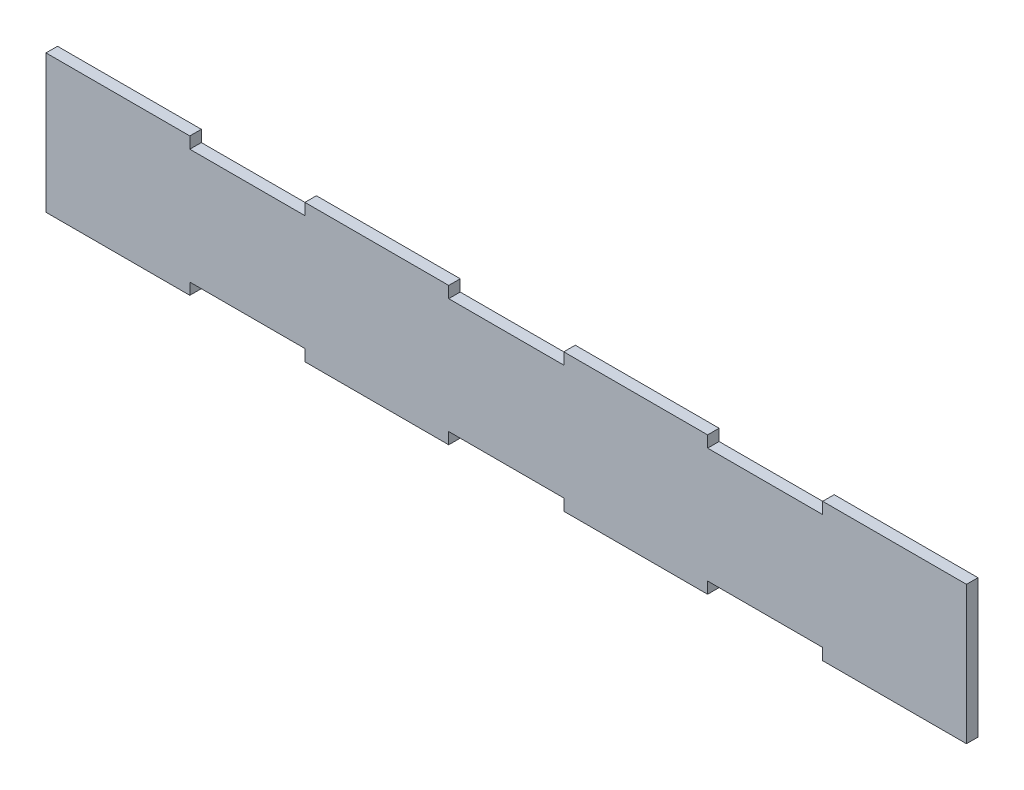
ISO-10303-21;
HEADER;
FILE_DESCRIPTION(('STEP AP214'),'2;1');
FILE_NAME('part.step','',(''),(''),'','','');
FILE_SCHEMA(('AUTOMOTIVE_DESIGN { 1 0 10303 214 1 1 1 1 }'));
ENDSEC;
DATA;
#1=APPLICATION_CONTEXT('core data for automotive mechanical design processes');
#2=APPLICATION_PROTOCOL_DEFINITION('international standard','automotive_design',2000,#1);
#3=PRODUCT_CONTEXT('',#1,'mechanical');
#4=PRODUCT('Part','Part','',(#3));
#5=PRODUCT_RELATED_PRODUCT_CATEGORY('part','',(#4));
#6=PRODUCT_DEFINITION_FORMATION('','',#4);
#7=PRODUCT_DEFINITION_CONTEXT('part definition',#1,'design');
#8=PRODUCT_DEFINITION('design','',#6,#7);
#9=PRODUCT_DEFINITION_SHAPE('','',#8);
#10=(LENGTH_UNIT() NAMED_UNIT(*) SI_UNIT(.MILLI.,.METRE.));
#11=(NAMED_UNIT(*) PLANE_ANGLE_UNIT() SI_UNIT($,.RADIAN.));
#12=(NAMED_UNIT(*) SI_UNIT($,.STERADIAN.) SOLID_ANGLE_UNIT());
#13=UNCERTAINTY_MEASURE_WITH_UNIT(LENGTH_MEASURE(1.E-05),#10,'distance_accuracy_value','');
#14=(GEOMETRIC_REPRESENTATION_CONTEXT(3) GLOBAL_UNCERTAINTY_ASSIGNED_CONTEXT((#13)) GLOBAL_UNIT_ASSIGNED_CONTEXT((#10,
#11,#12)) REPRESENTATION_CONTEXT('',''));
#15=CARTESIAN_POINT('',(0.,0.,0.));
#16=DIRECTION('',(0.,0.,1.));
#17=DIRECTION('',(1.,0.,0.));
#18=AXIS2_PLACEMENT_3D('',#15,#16,#17);
#19=CARTESIAN_POINT('',(115.,0.,2.));
#20=DIRECTION('',(-1.,0.,0.));
#21=DIRECTION('',(0.,0.,1.));
#22=AXIS2_PLACEMENT_3D('',#19,#20,#21);
#23=PLANE('',#22);
#24=DIRECTION('',(0.,1.,0.));
#25=VECTOR('',#24,1.);
#26=CARTESIAN_POINT('',(115.,0.,0.));
#27=LINE('',#26,#25);
#28=CARTESIAN_POINT('',(115.,0.,0.));
#29=VERTEX_POINT('',#28);
#30=CARTESIAN_POINT('',(115.,2.,0.));
#31=VERTEX_POINT('',#30);
#32=EDGE_CURVE('E263',#29,#31,#27,.T.);
#33=ORIENTED_EDGE('',*,*,#32,.T.);
#34=DIRECTION('',(0.,0.,-1.));
#35=VECTOR('',#34,1.);
#36=CARTESIAN_POINT('',(115.,2.,2.));
#37=LINE('',#36,#35);
#38=CARTESIAN_POINT('',(115.,2.,2.));
#39=VERTEX_POINT('',#38);
#40=EDGE_CURVE('E11',#39,#31,#37,.T.);
#41=ORIENTED_EDGE('',*,*,#40,.F.);
#42=DIRECTION('',(0.,1.,0.));
#43=VECTOR('',#42,1.);
#44=CARTESIAN_POINT('',(115.,0.,2.));
#45=LINE('',#44,#43);
#46=CARTESIAN_POINT('',(115.,0.,2.));
#47=VERTEX_POINT('',#46);
#48=EDGE_CURVE('E364',#47,#39,#45,.T.);
#49=ORIENTED_EDGE('',*,*,#48,.F.);
#50=DIRECTION('',(0.,0.,-1.));
#51=VECTOR('',#50,1.);
#52=CARTESIAN_POINT('',(115.,0.,2.));
#53=LINE('',#52,#51);
#54=EDGE_CURVE('E58',#47,#29,#53,.T.);
#55=ORIENTED_EDGE('',*,*,#54,.T.);
#56=EDGE_LOOP('',(#33,#41,#49,#55));
#57=FACE_BOUND('',#56,.T.);
#58=ADVANCED_FACE('F41',(#57),#23,.F.);
#59=CARTESIAN_POINT('',(0.,2.,2.));
#60=DIRECTION('',(0.,1.,0.));
#61=DIRECTION('',(0.,0.,1.));
#62=AXIS2_PLACEMENT_3D('',#59,#60,#61);
#63=PLANE('',#62);
#64=DIRECTION('',(1.,0.,0.));
#65=VECTOR('',#64,1.);
#66=CARTESIAN_POINT('',(0.,2.,0.));
#67=LINE('',#66,#65);
#68=CARTESIAN_POINT('',(135.,2.,0.));
#69=VERTEX_POINT('',#68);
#70=EDGE_CURVE('E266',#31,#69,#67,.T.);
#71=ORIENTED_EDGE('',*,*,#70,.T.);
#72=DIRECTION('',(0.,0.,-1.));
#73=VECTOR('',#72,1.);
#74=CARTESIAN_POINT('',(135.,2.,2.));
#75=LINE('',#74,#73);
#76=CARTESIAN_POINT('',(135.,2.,2.));
#77=VERTEX_POINT('',#76);
#78=EDGE_CURVE('E50',#77,#69,#75,.T.);
#79=ORIENTED_EDGE('',*,*,#78,.F.);
#80=DIRECTION('',(1.,0.,0.));
#81=VECTOR('',#80,1.);
#82=CARTESIAN_POINT('',(0.,2.,2.));
#83=LINE('',#82,#81);
#84=EDGE_CURVE('E156',#39,#77,#83,.T.);
#85=ORIENTED_EDGE('',*,*,#84,.F.);
#86=ORIENTED_EDGE('',*,*,#40,.T.);
#87=EDGE_LOOP('',(#71,#79,#85,#86));
#88=FACE_BOUND('',#87,.T.);
#89=ADVANCED_FACE('F449',(#88),#63,.F.);
#90=CARTESIAN_POINT('',(135.,0.,2.));
#91=DIRECTION('',(-1.,0.,0.));
#92=DIRECTION('',(0.,0.,1.));
#93=AXIS2_PLACEMENT_3D('',#90,#91,#92);
#94=PLANE('',#93);
#95=DIRECTION('',(0.,1.,0.));
#96=VECTOR('',#95,1.);
#97=CARTESIAN_POINT('',(135.,0.,0.));
#98=LINE('',#97,#96);
#99=CARTESIAN_POINT('',(135.,0.,0.));
#100=VERTEX_POINT('',#99);
#101=EDGE_CURVE('E270',#100,#69,#98,.T.);
#102=ORIENTED_EDGE('',*,*,#101,.F.);
#103=DIRECTION('',(0.,0.,-1.));
#104=VECTOR('',#103,1.);
#105=CARTESIAN_POINT('',(135.,0.,2.));
#106=LINE('',#105,#104);
#107=CARTESIAN_POINT('',(135.,0.,2.));
#108=VERTEX_POINT('',#107);
#109=EDGE_CURVE('E440',#108,#100,#106,.T.);
#110=ORIENTED_EDGE('',*,*,#109,.F.);
#111=DIRECTION('',(0.,1.,0.));
#112=VECTOR('',#111,1.);
#113=CARTESIAN_POINT('',(135.,0.,2.));
#114=LINE('',#113,#112);
#115=EDGE_CURVE('E448',#108,#77,#114,.T.);
#116=ORIENTED_EDGE('',*,*,#115,.T.);
#117=ORIENTED_EDGE('',*,*,#78,.T.);
#118=EDGE_LOOP('',(#102,#110,#116,#117));
#119=FACE_BOUND('',#118,.T.);
#120=ADVANCED_FACE('F446',(#119),#94,.T.);
#121=CARTESIAN_POINT('',(0.,0.,2.));
#122=DIRECTION('',(0.,1.,0.));
#123=DIRECTION('',(-1.,0.,0.));
#124=AXIS2_PLACEMENT_3D('',#121,#122,#123);
#125=PLANE('',#124);
#126=DIRECTION('',(1.,0.,0.));
#127=VECTOR('',#126,1.);
#128=CARTESIAN_POINT('',(0.,0.,0.));
#129=LINE('',#128,#127);
#130=CARTESIAN_POINT('',(160.,0.,0.));
#131=VERTEX_POINT('',#130);
#132=EDGE_CURVE('E274',#100,#131,#129,.T.);
#133=ORIENTED_EDGE('',*,*,#132,.T.);
#134=DIRECTION('',(0.,0.,-1.));
#135=VECTOR('',#134,1.);
#136=CARTESIAN_POINT('',(160.,0.,2.));
#137=LINE('',#136,#135);
#138=CARTESIAN_POINT('',(160.,0.,2.));
#139=VERTEX_POINT('',#138);
#140=EDGE_CURVE('E436',#139,#131,#137,.T.);
#141=ORIENTED_EDGE('',*,*,#140,.F.);
#142=DIRECTION('',(1.,0.,0.));
#143=VECTOR('',#142,1.);
#144=CARTESIAN_POINT('',(0.,0.,2.));
#145=LINE('',#144,#143);
#146=EDGE_CURVE('E468',#108,#139,#145,.T.);
#147=ORIENTED_EDGE('',*,*,#146,.F.);
#148=ORIENTED_EDGE('',*,*,#109,.T.);
#149=EDGE_LOOP('',(#133,#141,#147,#148));
#150=FACE_BOUND('',#149,.T.);
#151=ADVANCED_FACE('F458',(#150),#125,.F.);
#152=CARTESIAN_POINT('',(160.,0.,2.));
#153=DIRECTION('',(-1.,0.,0.));
#154=DIRECTION('',(0.,0.,1.));
#155=AXIS2_PLACEMENT_3D('',#152,#153,#154);
#156=PLANE('',#155);
#157=DIRECTION('',(0.,1.,0.));
#158=VECTOR('',#157,1.);
#159=CARTESIAN_POINT('',(160.,0.,0.));
#160=LINE('',#159,#158);
#161=CARTESIAN_POINT('',(160.,24.,0.));
#162=VERTEX_POINT('',#161);
#163=EDGE_CURVE('E277',#131,#162,#160,.T.);
#164=ORIENTED_EDGE('',*,*,#163,.T.);
#165=DIRECTION('',(0.,0.,-1.));
#166=VECTOR('',#165,1.);
#167=CARTESIAN_POINT('',(160.,24.,2.));
#168=LINE('',#167,#166);
#169=CARTESIAN_POINT('',(160.,24.,2.));
#170=VERTEX_POINT('',#169);
#171=EDGE_CURVE('E432',#170,#162,#168,.T.);
#172=ORIENTED_EDGE('',*,*,#171,.F.);
#173=DIRECTION('',(0.,1.,0.));
#174=VECTOR('',#173,1.);
#175=CARTESIAN_POINT('',(160.,0.,2.));
#176=LINE('',#175,#174);
#177=EDGE_CURVE('E464',#139,#170,#176,.T.);
#178=ORIENTED_EDGE('',*,*,#177,.F.);
#179=ORIENTED_EDGE('',*,*,#140,.T.);
#180=EDGE_LOOP('',(#164,#172,#178,#179));
#181=FACE_BOUND('',#180,.T.);
#182=ADVANCED_FACE('F462',(#181),#156,.F.);
#183=CARTESIAN_POINT('',(0.,24.,2.));
#184=DIRECTION('',(0.,-1.,0.));
#185=DIRECTION('',(1.,0.,0.));
#186=AXIS2_PLACEMENT_3D('',#183,#184,#185);
#187=PLANE('',#186);
#188=DIRECTION('',(-1.,0.,0.));
#189=VECTOR('',#188,1.);
#190=CARTESIAN_POINT('',(0.,24.,0.));
#191=LINE('',#190,#189);
#192=CARTESIAN_POINT('',(135.,24.,0.));
#193=VERTEX_POINT('',#192);
#194=EDGE_CURVE('E280',#162,#193,#191,.T.);
#195=ORIENTED_EDGE('',*,*,#194,.T.);
#196=DIRECTION('',(0.,0.,-1.));
#197=VECTOR('',#196,1.);
#198=CARTESIAN_POINT('',(135.,24.,2.));
#199=LINE('',#198,#197);
#200=CARTESIAN_POINT('',(135.,24.,2.));
#201=VERTEX_POINT('',#200);
#202=EDGE_CURVE('E428',#201,#193,#199,.T.);
#203=ORIENTED_EDGE('',*,*,#202,.F.);
#204=DIRECTION('',(-1.,0.,0.));
#205=VECTOR('',#204,1.);
#206=CARTESIAN_POINT('',(0.,24.,2.));
#207=LINE('',#206,#205);
#208=EDGE_CURVE('E467',#170,#201,#207,.T.);
#209=ORIENTED_EDGE('',*,*,#208,.F.);
#210=ORIENTED_EDGE('',*,*,#171,.T.);
#211=EDGE_LOOP('',(#195,#203,#209,#210));
#212=FACE_BOUND('',#211,.T.);
#213=ADVANCED_FACE('F578',(#212),#187,.F.);
#214=CARTESIAN_POINT('',(135.,0.,2.));
#215=DIRECTION('',(1.,0.,0.));
#216=DIRECTION('',(0.,0.,-1.));
#217=AXIS2_PLACEMENT_3D('',#214,#215,#216);
#218=PLANE('',#217);
#219=DIRECTION('',(0.,-1.,0.));
#220=VECTOR('',#219,1.);
#221=CARTESIAN_POINT('',(135.,0.,0.));
#222=LINE('',#221,#220);
#223=CARTESIAN_POINT('',(135.,22.,0.));
#224=VERTEX_POINT('',#223);
#225=EDGE_CURVE('E283',#193,#224,#222,.T.);
#226=ORIENTED_EDGE('',*,*,#225,.T.);
#227=DIRECTION('',(0.,0.,-1.));
#228=VECTOR('',#227,1.);
#229=CARTESIAN_POINT('',(135.,22.,2.));
#230=LINE('',#229,#228);
#231=CARTESIAN_POINT('',(135.,22.,2.));
#232=VERTEX_POINT('',#231);
#233=EDGE_CURVE('E425',#232,#224,#230,.T.);
#234=ORIENTED_EDGE('',*,*,#233,.F.);
#235=DIRECTION('',(0.,-1.,0.));
#236=VECTOR('',#235,1.);
#237=CARTESIAN_POINT('',(135.,0.,2.));
#238=LINE('',#237,#236);
#239=EDGE_CURVE('E472',#201,#232,#238,.T.);
#240=ORIENTED_EDGE('',*,*,#239,.F.);
#241=ORIENTED_EDGE('',*,*,#202,.T.);
#242=EDGE_LOOP('',(#226,#234,#240,#241));
#243=FACE_BOUND('',#242,.T.);
#244=ADVANCED_FACE('F581',(#243),#218,.F.);
#245=CARTESIAN_POINT('',(0.,22.,2.));
#246=DIRECTION('',(0.,1.,0.));
#247=DIRECTION('',(0.,0.,1.));
#248=AXIS2_PLACEMENT_3D('',#245,#246,#247);
#249=PLANE('',#248);
#250=DIRECTION('',(1.,0.,0.));
#251=VECTOR('',#250,1.);
#252=CARTESIAN_POINT('',(0.,22.,0.));
#253=LINE('',#252,#251);
#254=CARTESIAN_POINT('',(115.,22.,0.));
#255=VERTEX_POINT('',#254);
#256=EDGE_CURVE('E287',#255,#224,#253,.T.);
#257=ORIENTED_EDGE('',*,*,#256,.F.);
#258=DIRECTION('',(0.,0.,-1.));
#259=VECTOR('',#258,1.);
#260=CARTESIAN_POINT('',(115.,22.,2.));
#261=LINE('',#260,#259);
#262=CARTESIAN_POINT('',(115.,22.,2.));
#263=VERTEX_POINT('',#262);
#264=EDGE_CURVE('E422',#263,#255,#261,.T.);
#265=ORIENTED_EDGE('',*,*,#264,.F.);
#266=DIRECTION('',(1.,0.,0.));
#267=VECTOR('',#266,1.);
#268=CARTESIAN_POINT('',(0.,22.,2.));
#269=LINE('',#268,#267);
#270=EDGE_CURVE('E479',#263,#232,#269,.T.);
#271=ORIENTED_EDGE('',*,*,#270,.T.);
#272=ORIENTED_EDGE('',*,*,#233,.T.);
#273=EDGE_LOOP('',(#257,#265,#271,#272));
#274=FACE_BOUND('',#273,.T.);
#275=ADVANCED_FACE('F585',(#274),#249,.T.);
#276=CARTESIAN_POINT('',(115.,0.,2.));
#277=DIRECTION('',(1.,0.,0.));
#278=DIRECTION('',(0.,0.,-1.));
#279=AXIS2_PLACEMENT_3D('',#276,#277,#278);
#280=PLANE('',#279);
#281=DIRECTION('',(0.,-1.,0.));
#282=VECTOR('',#281,1.);
#283=CARTESIAN_POINT('',(115.,0.,0.));
#284=LINE('',#283,#282);
#285=CARTESIAN_POINT('',(115.,24.,0.));
#286=VERTEX_POINT('',#285);
#287=EDGE_CURVE('E291',#286,#255,#284,.T.);
#288=ORIENTED_EDGE('',*,*,#287,.F.);
#289=DIRECTION('',(0.,0.,-1.));
#290=VECTOR('',#289,1.);
#291=CARTESIAN_POINT('',(115.,24.,2.));
#292=LINE('',#291,#290);
#293=CARTESIAN_POINT('',(115.,24.,2.));
#294=VERTEX_POINT('',#293);
#295=EDGE_CURVE('E419',#294,#286,#292,.T.);
#296=ORIENTED_EDGE('',*,*,#295,.F.);
#297=DIRECTION('',(0.,-1.,0.));
#298=VECTOR('',#297,1.);
#299=CARTESIAN_POINT('',(115.,0.,2.));
#300=LINE('',#299,#298);
#301=EDGE_CURVE('E483',#294,#263,#300,.T.);
#302=ORIENTED_EDGE('',*,*,#301,.T.);
#303=ORIENTED_EDGE('',*,*,#264,.T.);
#304=EDGE_LOOP('',(#288,#296,#302,#303));
#305=FACE_BOUND('',#304,.T.);
#306=ADVANCED_FACE('F589',(#305),#280,.T.);
#307=CARTESIAN_POINT('',(0.,24.,2.));
#308=DIRECTION('',(0.,1.,0.));
#309=DIRECTION('',(0.,0.,1.));
#310=AXIS2_PLACEMENT_3D('',#307,#308,#309);
#311=PLANE('',#310);
#312=DIRECTION('',(1.,0.,0.));
#313=VECTOR('',#312,1.);
#314=CARTESIAN_POINT('',(0.,24.,0.));
#315=LINE('',#314,#313);
#316=CARTESIAN_POINT('',(90.,24.,0.));
#317=VERTEX_POINT('',#316);
#318=EDGE_CURVE('E295',#317,#286,#315,.T.);
#319=ORIENTED_EDGE('',*,*,#318,.F.);
#320=DIRECTION('',(0.,0.,-1.));
#321=VECTOR('',#320,1.);
#322=CARTESIAN_POINT('',(90.,24.,2.));
#323=LINE('',#322,#321);
#324=CARTESIAN_POINT('',(90.,24.,2.));
#325=VERTEX_POINT('',#324);
#326=EDGE_CURVE('E416',#325,#317,#323,.T.);
#327=ORIENTED_EDGE('',*,*,#326,.F.);
#328=DIRECTION('',(1.,0.,0.));
#329=VECTOR('',#328,1.);
#330=CARTESIAN_POINT('',(0.,24.,2.));
#331=LINE('',#330,#329);
#332=EDGE_CURVE('E487',#325,#294,#331,.T.);
#333=ORIENTED_EDGE('',*,*,#332,.T.);
#334=ORIENTED_EDGE('',*,*,#295,.T.);
#335=EDGE_LOOP('',(#319,#327,#333,#334));
#336=FACE_BOUND('',#335,.T.);
#337=ADVANCED_FACE('F593',(#336),#311,.T.);
#338=CARTESIAN_POINT('',(90.,0.,2.));
#339=DIRECTION('',(1.,0.,0.));
#340=DIRECTION('',(0.,0.,-1.));
#341=AXIS2_PLACEMENT_3D('',#338,#339,#340);
#342=PLANE('',#341);
#343=DIRECTION('',(0.,-1.,0.));
#344=VECTOR('',#343,1.);
#345=CARTESIAN_POINT('',(90.,0.,0.));
#346=LINE('',#345,#344);
#347=CARTESIAN_POINT('',(90.,22.,0.));
#348=VERTEX_POINT('',#347);
#349=EDGE_CURVE('E299',#317,#348,#346,.T.);
#350=ORIENTED_EDGE('',*,*,#349,.T.);
#351=DIRECTION('',(0.,0.,-1.));
#352=VECTOR('',#351,1.);
#353=CARTESIAN_POINT('',(90.,22.,2.));
#354=LINE('',#353,#352);
#355=CARTESIAN_POINT('',(90.,22.,2.));
#356=VERTEX_POINT('',#355);
#357=EDGE_CURVE('E413',#356,#348,#354,.T.);
#358=ORIENTED_EDGE('',*,*,#357,.F.);
#359=DIRECTION('',(0.,-1.,0.));
#360=VECTOR('',#359,1.);
#361=CARTESIAN_POINT('',(90.,0.,2.));
#362=LINE('',#361,#360);
#363=EDGE_CURVE('E491',#325,#356,#362,.T.);
#364=ORIENTED_EDGE('',*,*,#363,.F.);
#365=ORIENTED_EDGE('',*,*,#326,.T.);
#366=EDGE_LOOP('',(#350,#358,#364,#365));
#367=FACE_BOUND('',#366,.T.);
#368=ADVANCED_FACE('F597',(#367),#342,.F.);
#369=CARTESIAN_POINT('',(0.,22.,2.));
#370=DIRECTION('',(0.,1.,0.));
#371=DIRECTION('',(0.,0.,1.));
#372=AXIS2_PLACEMENT_3D('',#369,#370,#371);
#373=PLANE('',#372);
#374=DIRECTION('',(1.,0.,0.));
#375=VECTOR('',#374,1.);
#376=CARTESIAN_POINT('',(0.,22.,0.));
#377=LINE('',#376,#375);
#378=CARTESIAN_POINT('',(70.,22.,0.));
#379=VERTEX_POINT('',#378);
#380=EDGE_CURVE('E303',#379,#348,#377,.T.);
#381=ORIENTED_EDGE('',*,*,#380,.F.);
#382=DIRECTION('',(0.,0.,-1.));
#383=VECTOR('',#382,1.);
#384=CARTESIAN_POINT('',(70.,22.,2.));
#385=LINE('',#384,#383);
#386=CARTESIAN_POINT('',(70.,22.,2.));
#387=VERTEX_POINT('',#386);
#388=EDGE_CURVE('E410',#387,#379,#385,.T.);
#389=ORIENTED_EDGE('',*,*,#388,.F.);
#390=DIRECTION('',(1.,0.,0.));
#391=VECTOR('',#390,1.);
#392=CARTESIAN_POINT('',(0.,22.,2.));
#393=LINE('',#392,#391);
#394=EDGE_CURVE('E494',#387,#356,#393,.T.);
#395=ORIENTED_EDGE('',*,*,#394,.T.);
#396=ORIENTED_EDGE('',*,*,#357,.T.);
#397=EDGE_LOOP('',(#381,#389,#395,#396));
#398=FACE_BOUND('',#397,.T.);
#399=ADVANCED_FACE('F601',(#398),#373,.T.);
#400=CARTESIAN_POINT('',(70.,0.,2.));
#401=DIRECTION('',(1.,0.,0.));
#402=DIRECTION('',(0.,0.,-1.));
#403=AXIS2_PLACEMENT_3D('',#400,#401,#402);
#404=PLANE('',#403);
#405=DIRECTION('',(0.,-1.,0.));
#406=VECTOR('',#405,1.);
#407=CARTESIAN_POINT('',(70.,0.,0.));
#408=LINE('',#407,#406);
#409=CARTESIAN_POINT('',(70.,24.,0.));
#410=VERTEX_POINT('',#409);
#411=EDGE_CURVE('E307',#410,#379,#408,.T.);
#412=ORIENTED_EDGE('',*,*,#411,.F.);
#413=DIRECTION('',(0.,0.,-1.));
#414=VECTOR('',#413,1.);
#415=CARTESIAN_POINT('',(70.,24.,2.));
#416=LINE('',#415,#414);
#417=CARTESIAN_POINT('',(70.,24.,2.));
#418=VERTEX_POINT('',#417);
#419=EDGE_CURVE('E407',#418,#410,#416,.T.);
#420=ORIENTED_EDGE('',*,*,#419,.F.);
#421=DIRECTION('',(0.,-1.,0.));
#422=VECTOR('',#421,1.);
#423=CARTESIAN_POINT('',(70.,0.,2.));
#424=LINE('',#423,#422);
#425=EDGE_CURVE('E498',#418,#387,#424,.T.);
#426=ORIENTED_EDGE('',*,*,#425,.T.);
#427=ORIENTED_EDGE('',*,*,#388,.T.);
#428=EDGE_LOOP('',(#412,#420,#426,#427));
#429=FACE_BOUND('',#428,.T.);
#430=ADVANCED_FACE('F605',(#429),#404,.T.);
#431=CARTESIAN_POINT('',(0.,24.,2.));
#432=DIRECTION('',(0.,1.,0.));
#433=DIRECTION('',(0.,0.,1.));
#434=AXIS2_PLACEMENT_3D('',#431,#432,#433);
#435=PLANE('',#434);
#436=DIRECTION('',(1.,0.,0.));
#437=VECTOR('',#436,1.);
#438=CARTESIAN_POINT('',(0.,24.,0.));
#439=LINE('',#438,#437);
#440=CARTESIAN_POINT('',(45.,24.,0.));
#441=VERTEX_POINT('',#440);
#442=EDGE_CURVE('E311',#441,#410,#439,.T.);
#443=ORIENTED_EDGE('',*,*,#442,.F.);
#444=DIRECTION('',(0.,0.,-1.));
#445=VECTOR('',#444,1.);
#446=CARTESIAN_POINT('',(45.,24.,2.));
#447=LINE('',#446,#445);
#448=CARTESIAN_POINT('',(45.,24.,2.));
#449=VERTEX_POINT('',#448);
#450=EDGE_CURVE('E404',#449,#441,#447,.T.);
#451=ORIENTED_EDGE('',*,*,#450,.F.);
#452=DIRECTION('',(1.,0.,0.));
#453=VECTOR('',#452,1.);
#454=CARTESIAN_POINT('',(0.,24.,2.));
#455=LINE('',#454,#453);
#456=EDGE_CURVE('E502',#449,#418,#455,.T.);
#457=ORIENTED_EDGE('',*,*,#456,.T.);
#458=ORIENTED_EDGE('',*,*,#419,.T.);
#459=EDGE_LOOP('',(#443,#451,#457,#458));
#460=FACE_BOUND('',#459,.T.);
#461=ADVANCED_FACE('F609',(#460),#435,.T.);
#462=CARTESIAN_POINT('',(45.,0.,2.));
#463=DIRECTION('',(1.,0.,0.));
#464=DIRECTION('',(0.,0.,-1.));
#465=AXIS2_PLACEMENT_3D('',#462,#463,#464);
#466=PLANE('',#465);
#467=DIRECTION('',(0.,-1.,0.));
#468=VECTOR('',#467,1.);
#469=CARTESIAN_POINT('',(45.,0.,0.));
#470=LINE('',#469,#468);
#471=CARTESIAN_POINT('',(45.,22.,0.));
#472=VERTEX_POINT('',#471);
#473=EDGE_CURVE('E315',#441,#472,#470,.T.);
#474=ORIENTED_EDGE('',*,*,#473,.T.);
#475=DIRECTION('',(0.,0.,-1.));
#476=VECTOR('',#475,1.);
#477=CARTESIAN_POINT('',(45.,22.,2.));
#478=LINE('',#477,#476);
#479=CARTESIAN_POINT('',(45.,22.,2.));
#480=VERTEX_POINT('',#479);
#481=EDGE_CURVE('E401',#480,#472,#478,.T.);
#482=ORIENTED_EDGE('',*,*,#481,.F.);
#483=DIRECTION('',(0.,-1.,0.));
#484=VECTOR('',#483,1.);
#485=CARTESIAN_POINT('',(45.,0.,2.));
#486=LINE('',#485,#484);
#487=EDGE_CURVE('E506',#449,#480,#486,.T.);
#488=ORIENTED_EDGE('',*,*,#487,.F.);
#489=ORIENTED_EDGE('',*,*,#450,.T.);
#490=EDGE_LOOP('',(#474,#482,#488,#489));
#491=FACE_BOUND('',#490,.T.);
#492=ADVANCED_FACE('F613',(#491),#466,.F.);
#493=CARTESIAN_POINT('',(0.,22.,2.));
#494=DIRECTION('',(0.,1.,0.));
#495=DIRECTION('',(0.,0.,1.));
#496=AXIS2_PLACEMENT_3D('',#493,#494,#495);
#497=PLANE('',#496);
#498=DIRECTION('',(1.,0.,0.));
#499=VECTOR('',#498,1.);
#500=CARTESIAN_POINT('',(0.,22.,0.));
#501=LINE('',#500,#499);
#502=CARTESIAN_POINT('',(25.,22.,0.));
#503=VERTEX_POINT('',#502);
#504=EDGE_CURVE('E319',#503,#472,#501,.T.);
#505=ORIENTED_EDGE('',*,*,#504,.F.);
#506=DIRECTION('',(0.,0.,-1.));
#507=VECTOR('',#506,1.);
#508=CARTESIAN_POINT('',(25.,22.,2.));
#509=LINE('',#508,#507);
#510=CARTESIAN_POINT('',(25.,22.,2.));
#511=VERTEX_POINT('',#510);
#512=EDGE_CURVE('E398',#511,#503,#509,.T.);
#513=ORIENTED_EDGE('',*,*,#512,.F.);
#514=DIRECTION('',(1.,0.,0.));
#515=VECTOR('',#514,1.);
#516=CARTESIAN_POINT('',(0.,22.,2.));
#517=LINE('',#516,#515);
#518=EDGE_CURVE('E509',#511,#480,#517,.T.);
#519=ORIENTED_EDGE('',*,*,#518,.T.);
#520=ORIENTED_EDGE('',*,*,#481,.T.);
#521=EDGE_LOOP('',(#505,#513,#519,#520));
#522=FACE_BOUND('',#521,.T.);
#523=ADVANCED_FACE('F617',(#522),#497,.T.);
#524=CARTESIAN_POINT('',(25.,0.,2.));
#525=DIRECTION('',(1.,0.,0.));
#526=DIRECTION('',(0.,0.,-1.));
#527=AXIS2_PLACEMENT_3D('',#524,#525,#526);
#528=PLANE('',#527);
#529=DIRECTION('',(0.,-1.,0.));
#530=VECTOR('',#529,1.);
#531=CARTESIAN_POINT('',(25.,0.,0.));
#532=LINE('',#531,#530);
#533=CARTESIAN_POINT('',(25.,24.,0.));
#534=VERTEX_POINT('',#533);
#535=EDGE_CURVE('E323',#534,#503,#532,.T.);
#536=ORIENTED_EDGE('',*,*,#535,.F.);
#537=DIRECTION('',(0.,0.,-1.));
#538=VECTOR('',#537,1.);
#539=CARTESIAN_POINT('',(25.,24.,2.));
#540=LINE('',#539,#538);
#541=CARTESIAN_POINT('',(25.,24.,2.));
#542=VERTEX_POINT('',#541);
#543=EDGE_CURVE('E395',#542,#534,#540,.T.);
#544=ORIENTED_EDGE('',*,*,#543,.F.);
#545=DIRECTION('',(0.,-1.,0.));
#546=VECTOR('',#545,1.);
#547=CARTESIAN_POINT('',(25.,0.,2.));
#548=LINE('',#547,#546);
#549=EDGE_CURVE('E513',#542,#511,#548,.T.);
#550=ORIENTED_EDGE('',*,*,#549,.T.);
#551=ORIENTED_EDGE('',*,*,#512,.T.);
#552=EDGE_LOOP('',(#536,#544,#550,#551));
#553=FACE_BOUND('',#552,.T.);
#554=ADVANCED_FACE('F621',(#553),#528,.T.);
#555=CARTESIAN_POINT('',(0.,24.,2.));
#556=DIRECTION('',(0.,1.,0.));
#557=DIRECTION('',(0.,0.,1.));
#558=AXIS2_PLACEMENT_3D('',#555,#556,#557);
#559=PLANE('',#558);
#560=DIRECTION('',(1.,0.,0.));
#561=VECTOR('',#560,1.);
#562=CARTESIAN_POINT('',(0.,24.,0.));
#563=LINE('',#562,#561);
#564=CARTESIAN_POINT('',(0.,24.,0.));
#565=VERTEX_POINT('',#564);
#566=EDGE_CURVE('E327',#565,#534,#563,.T.);
#567=ORIENTED_EDGE('',*,*,#566,.F.);
#568=DIRECTION('',(0.,0.,-1.));
#569=VECTOR('',#568,1.);
#570=CARTESIAN_POINT('',(0.,24.,2.));
#571=LINE('',#570,#569);
#572=CARTESIAN_POINT('',(0.,24.,2.));
#573=VERTEX_POINT('',#572);
#574=EDGE_CURVE('E392',#573,#565,#571,.T.);
#575=ORIENTED_EDGE('',*,*,#574,.F.);
#576=DIRECTION('',(1.,0.,0.));
#577=VECTOR('',#576,1.);
#578=CARTESIAN_POINT('',(0.,24.,2.));
#579=LINE('',#578,#577);
#580=EDGE_CURVE('E517',#573,#542,#579,.T.);
#581=ORIENTED_EDGE('',*,*,#580,.T.);
#582=ORIENTED_EDGE('',*,*,#543,.T.);
#583=EDGE_LOOP('',(#567,#575,#581,#582));
#584=FACE_BOUND('',#583,.T.);
#585=ADVANCED_FACE('F625',(#584),#559,.T.);
#586=CARTESIAN_POINT('',(0.,0.,2.));
#587=DIRECTION('',(-1.,0.,0.));
#588=DIRECTION('',(0.,0.,1.));
#589=AXIS2_PLACEMENT_3D('',#586,#587,#588);
#590=PLANE('',#589);
#591=DIRECTION('',(0.,1.,0.));
#592=VECTOR('',#591,1.);
#593=CARTESIAN_POINT('',(0.,0.,0.));
#594=LINE('',#593,#592);
#595=CARTESIAN_POINT('',(0.,0.,0.));
#596=VERTEX_POINT('',#595);
#597=EDGE_CURVE('E331',#596,#565,#594,.T.);
#598=ORIENTED_EDGE('',*,*,#597,.F.);
#599=DIRECTION('',(0.,0.,-1.));
#600=VECTOR('',#599,1.);
#601=CARTESIAN_POINT('',(0.,0.,2.));
#602=LINE('',#601,#600);
#603=CARTESIAN_POINT('',(0.,0.,2.));
#604=VERTEX_POINT('',#603);
#605=EDGE_CURVE('E389',#604,#596,#602,.T.);
#606=ORIENTED_EDGE('',*,*,#605,.F.);
#607=DIRECTION('',(0.,1.,0.));
#608=VECTOR('',#607,1.);
#609=CARTESIAN_POINT('',(0.,0.,2.));
#610=LINE('',#609,#608);
#611=EDGE_CURVE('E521',#604,#573,#610,.T.);
#612=ORIENTED_EDGE('',*,*,#611,.T.);
#613=ORIENTED_EDGE('',*,*,#574,.T.);
#614=EDGE_LOOP('',(#598,#606,#612,#613));
#615=FACE_BOUND('',#614,.T.);
#616=ADVANCED_FACE('F629',(#615),#590,.T.);
#617=CARTESIAN_POINT('',(0.,0.,2.));
#618=DIRECTION('',(0.,1.,0.));
#619=DIRECTION('',(0.,0.,1.));
#620=AXIS2_PLACEMENT_3D('',#617,#618,#619);
#621=PLANE('',#620);
#622=DIRECTION('',(1.,0.,0.));
#623=VECTOR('',#622,1.);
#624=CARTESIAN_POINT('',(0.,0.,0.));
#625=LINE('',#624,#623);
#626=CARTESIAN_POINT('',(25.,0.,0.));
#627=VERTEX_POINT('',#626);
#628=EDGE_CURVE('E335',#596,#627,#625,.T.);
#629=ORIENTED_EDGE('',*,*,#628,.T.);
#630=DIRECTION('',(0.,0.,-1.));
#631=VECTOR('',#630,1.);
#632=CARTESIAN_POINT('',(25.,0.,2.));
#633=LINE('',#632,#631);
#634=CARTESIAN_POINT('',(25.,0.,2.));
#635=VERTEX_POINT('',#634);
#636=EDGE_CURVE('E385',#635,#627,#633,.T.);
#637=ORIENTED_EDGE('',*,*,#636,.F.);
#638=DIRECTION('',(1.,0.,0.));
#639=VECTOR('',#638,1.);
#640=CARTESIAN_POINT('',(0.,0.,2.));
#641=LINE('',#640,#639);
#642=EDGE_CURVE('E525',#604,#635,#641,.T.);
#643=ORIENTED_EDGE('',*,*,#642,.F.);
#644=ORIENTED_EDGE('',*,*,#605,.T.);
#645=EDGE_LOOP('',(#629,#637,#643,#644));
#646=FACE_BOUND('',#645,.T.);
#647=ADVANCED_FACE('F633',(#646),#621,.F.);
#648=CARTESIAN_POINT('',(25.,0.,2.));
#649=DIRECTION('',(-1.,0.,0.));
#650=DIRECTION('',(0.,0.,1.));
#651=AXIS2_PLACEMENT_3D('',#648,#649,#650);
#652=PLANE('',#651);
#653=DIRECTION('',(0.,1.,0.));
#654=VECTOR('',#653,1.);
#655=CARTESIAN_POINT('',(25.,0.,0.));
#656=LINE('',#655,#654);
#657=CARTESIAN_POINT('',(25.,2.,0.));
#658=VERTEX_POINT('',#657);
#659=EDGE_CURVE('E338',#627,#658,#656,.T.);
#660=ORIENTED_EDGE('',*,*,#659,.T.);
#661=DIRECTION('',(0.,0.,-1.));
#662=VECTOR('',#661,1.);
#663=CARTESIAN_POINT('',(25.,2.,2.));
#664=LINE('',#663,#662);
#665=CARTESIAN_POINT('',(25.,2.,2.));
#666=VERTEX_POINT('',#665);
#667=EDGE_CURVE('E381',#666,#658,#664,.T.);
#668=ORIENTED_EDGE('',*,*,#667,.F.);
#669=DIRECTION('',(0.,1.,0.));
#670=VECTOR('',#669,1.);
#671=CARTESIAN_POINT('',(25.,0.,2.));
#672=LINE('',#671,#670);
#673=EDGE_CURVE('E528',#635,#666,#672,.T.);
#674=ORIENTED_EDGE('',*,*,#673,.F.);
#675=ORIENTED_EDGE('',*,*,#636,.T.);
#676=EDGE_LOOP('',(#660,#668,#674,#675));
#677=FACE_BOUND('',#676,.T.);
#678=ADVANCED_FACE('F637',(#677),#652,.F.);
#679=CARTESIAN_POINT('',(0.,2.,2.));
#680=DIRECTION('',(0.,1.,0.));
#681=DIRECTION('',(0.,0.,1.));
#682=AXIS2_PLACEMENT_3D('',#679,#680,#681);
#683=PLANE('',#682);
#684=DIRECTION('',(1.,0.,0.));
#685=VECTOR('',#684,1.);
#686=CARTESIAN_POINT('',(0.,2.,0.));
#687=LINE('',#686,#685);
#688=CARTESIAN_POINT('',(45.,2.,0.));
#689=VERTEX_POINT('',#688);
#690=EDGE_CURVE('E341',#658,#689,#687,.T.);
#691=ORIENTED_EDGE('',*,*,#690,.T.);
#692=DIRECTION('',(0.,0.,-1.));
#693=VECTOR('',#692,1.);
#694=CARTESIAN_POINT('',(45.,2.,2.));
#695=LINE('',#694,#693);
#696=CARTESIAN_POINT('',(45.,2.,2.));
#697=VERTEX_POINT('',#696);
#698=EDGE_CURVE('E378',#697,#689,#695,.T.);
#699=ORIENTED_EDGE('',*,*,#698,.F.);
#700=DIRECTION('',(1.,0.,0.));
#701=VECTOR('',#700,1.);
#702=CARTESIAN_POINT('',(0.,2.,2.));
#703=LINE('',#702,#701);
#704=EDGE_CURVE('E531',#666,#697,#703,.T.);
#705=ORIENTED_EDGE('',*,*,#704,.F.);
#706=ORIENTED_EDGE('',*,*,#667,.T.);
#707=EDGE_LOOP('',(#691,#699,#705,#706));
#708=FACE_BOUND('',#707,.T.);
#709=ADVANCED_FACE('F641',(#708),#683,.F.);
#710=CARTESIAN_POINT('',(45.,0.,2.));
#711=DIRECTION('',(-1.,0.,0.));
#712=DIRECTION('',(0.,0.,1.));
#713=AXIS2_PLACEMENT_3D('',#710,#711,#712);
#714=PLANE('',#713);
#715=DIRECTION('',(0.,1.,0.));
#716=VECTOR('',#715,1.);
#717=CARTESIAN_POINT('',(45.,0.,0.));
#718=LINE('',#717,#716);
#719=CARTESIAN_POINT('',(45.,0.,0.));
#720=VERTEX_POINT('',#719);
#721=EDGE_CURVE('E345',#720,#689,#718,.T.);
#722=ORIENTED_EDGE('',*,*,#721,.F.);
#723=DIRECTION('',(0.,0.,-1.));
#724=VECTOR('',#723,1.);
#725=CARTESIAN_POINT('',(45.,0.,2.));
#726=LINE('',#725,#724);
#727=CARTESIAN_POINT('',(45.,0.,2.));
#728=VERTEX_POINT('',#727);
#729=EDGE_CURVE('E375',#728,#720,#726,.T.);
#730=ORIENTED_EDGE('',*,*,#729,.F.);
#731=DIRECTION('',(0.,1.,0.));
#732=VECTOR('',#731,1.);
#733=CARTESIAN_POINT('',(45.,0.,2.));
#734=LINE('',#733,#732);
#735=EDGE_CURVE('E534',#728,#697,#734,.T.);
#736=ORIENTED_EDGE('',*,*,#735,.T.);
#737=ORIENTED_EDGE('',*,*,#698,.T.);
#738=EDGE_LOOP('',(#722,#730,#736,#737));
#739=FACE_BOUND('',#738,.T.);
#740=ADVANCED_FACE('F645',(#739),#714,.T.);
#741=CARTESIAN_POINT('',(0.,0.,2.));
#742=DIRECTION('',(0.,1.,0.));
#743=DIRECTION('',(0.,0.,1.));
#744=AXIS2_PLACEMENT_3D('',#741,#742,#743);
#745=PLANE('',#744);
#746=DIRECTION('',(1.,0.,0.));
#747=VECTOR('',#746,1.);
#748=CARTESIAN_POINT('',(0.,0.,0.));
#749=LINE('',#748,#747);
#750=CARTESIAN_POINT('',(70.,0.,0.));
#751=VERTEX_POINT('',#750);
#752=EDGE_CURVE('E349',#720,#751,#749,.T.);
#753=ORIENTED_EDGE('',*,*,#752,.T.);
#754=DIRECTION('',(0.,0.,-1.));
#755=VECTOR('',#754,1.);
#756=CARTESIAN_POINT('',(70.,0.,2.));
#757=LINE('',#756,#755);
#758=CARTESIAN_POINT('',(70.,0.,2.));
#759=VERTEX_POINT('',#758);
#760=EDGE_CURVE('E371',#759,#751,#757,.T.);
#761=ORIENTED_EDGE('',*,*,#760,.F.);
#762=DIRECTION('',(1.,0.,0.));
#763=VECTOR('',#762,1.);
#764=CARTESIAN_POINT('',(0.,0.,2.));
#765=LINE('',#764,#763);
#766=EDGE_CURVE('E538',#728,#759,#765,.T.);
#767=ORIENTED_EDGE('',*,*,#766,.F.);
#768=ORIENTED_EDGE('',*,*,#729,.T.);
#769=EDGE_LOOP('',(#753,#761,#767,#768));
#770=FACE_BOUND('',#769,.T.);
#771=ADVANCED_FACE('F545',(#770),#745,.F.);
#772=CARTESIAN_POINT('',(70.,0.,2.));
#773=DIRECTION('',(-1.,0.,0.));
#774=DIRECTION('',(0.,0.,1.));
#775=AXIS2_PLACEMENT_3D('',#772,#773,#774);
#776=PLANE('',#775);
#777=DIRECTION('',(0.,1.,0.));
#778=VECTOR('',#777,1.);
#779=CARTESIAN_POINT('',(70.,0.,0.));
#780=LINE('',#779,#778);
#781=CARTESIAN_POINT('',(70.,2.,0.));
#782=VERTEX_POINT('',#781);
#783=EDGE_CURVE('E352',#751,#782,#780,.T.);
#784=ORIENTED_EDGE('',*,*,#783,.T.);
#785=DIRECTION('',(0.,0.,-1.));
#786=VECTOR('',#785,1.);
#787=CARTESIAN_POINT('',(70.,2.,2.));
#788=LINE('',#787,#786);
#789=CARTESIAN_POINT('',(70.,2.,2.));
#790=VERTEX_POINT('',#789);
#791=EDGE_CURVE('E253',#790,#782,#788,.T.);
#792=ORIENTED_EDGE('',*,*,#791,.F.);
#793=DIRECTION('',(0.,1.,0.));
#794=VECTOR('',#793,1.);
#795=CARTESIAN_POINT('',(70.,0.,2.));
#796=LINE('',#795,#794);
#797=EDGE_CURVE('E239',#759,#790,#796,.T.);
#798=ORIENTED_EDGE('',*,*,#797,.F.);
#799=ORIENTED_EDGE('',*,*,#760,.T.);
#800=EDGE_LOOP('',(#784,#792,#798,#799));
#801=FACE_BOUND('',#800,.T.);
#802=ADVANCED_FACE('F549',(#801),#776,.F.);
#803=CARTESIAN_POINT('',(0.,2.,2.));
#804=DIRECTION('',(0.,1.,0.));
#805=DIRECTION('',(0.,0.,1.));
#806=AXIS2_PLACEMENT_3D('',#803,#804,#805);
#807=PLANE('',#806);
#808=DIRECTION('',(1.,0.,0.));
#809=VECTOR('',#808,1.);
#810=CARTESIAN_POINT('',(0.,2.,0.));
#811=LINE('',#810,#809);
#812=CARTESIAN_POINT('',(90.,2.,0.));
#813=VERTEX_POINT('',#812);
#814=EDGE_CURVE('E249',#782,#813,#811,.T.);
#815=ORIENTED_EDGE('',*,*,#814,.T.);
#816=DIRECTION('',(0.,0.,-1.));
#817=VECTOR('',#816,1.);
#818=CARTESIAN_POINT('',(90.,2.,2.));
#819=LINE('',#818,#817);
#820=CARTESIAN_POINT('',(90.,2.,2.));
#821=VERTEX_POINT('',#820);
#822=EDGE_CURVE('E246',#821,#813,#819,.T.);
#823=ORIENTED_EDGE('',*,*,#822,.F.);
#824=DIRECTION('',(1.,0.,0.));
#825=VECTOR('',#824,1.);
#826=CARTESIAN_POINT('',(0.,2.,2.));
#827=LINE('',#826,#825);
#828=EDGE_CURVE('E232',#790,#821,#827,.T.);
#829=ORIENTED_EDGE('',*,*,#828,.F.);
#830=ORIENTED_EDGE('',*,*,#791,.T.);
#831=EDGE_LOOP('',(#815,#823,#829,#830));
#832=FACE_BOUND('',#831,.T.);
#833=ADVANCED_FACE('F247',(#832),#807,.F.);
#834=CARTESIAN_POINT('',(90.,0.,2.));
#835=DIRECTION('',(-1.,0.,0.));
#836=DIRECTION('',(0.,0.,1.));
#837=AXIS2_PLACEMENT_3D('',#834,#835,#836);
#838=PLANE('',#837);
#839=DIRECTION('',(0.,1.,0.));
#840=VECTOR('',#839,1.);
#841=CARTESIAN_POINT('',(90.,0.,0.));
#842=LINE('',#841,#840);
#843=CARTESIAN_POINT('',(90.,0.,0.));
#844=VERTEX_POINT('',#843);
#845=EDGE_CURVE('E357',#844,#813,#842,.T.);
#846=ORIENTED_EDGE('',*,*,#845,.F.);
#847=DIRECTION('',(0.,0.,-1.));
#848=VECTOR('',#847,1.);
#849=CARTESIAN_POINT('',(90.,0.,2.));
#850=LINE('',#849,#848);
#851=CARTESIAN_POINT('',(90.,0.,2.));
#852=VERTEX_POINT('',#851);
#853=EDGE_CURVE('E144',#852,#844,#850,.T.);
#854=ORIENTED_EDGE('',*,*,#853,.F.);
#855=DIRECTION('',(0.,1.,0.));
#856=VECTOR('',#855,1.);
#857=CARTESIAN_POINT('',(90.,0.,2.));
#858=LINE('',#857,#856);
#859=EDGE_CURVE('E237',#852,#821,#858,.T.);
#860=ORIENTED_EDGE('',*,*,#859,.T.);
#861=ORIENTED_EDGE('',*,*,#822,.T.);
#862=EDGE_LOOP('',(#846,#854,#860,#861));
#863=FACE_BOUND('',#862,.T.);
#864=ADVANCED_FACE('F255',(#863),#838,.T.);
#865=CARTESIAN_POINT('',(0.,0.,2.));
#866=DIRECTION('',(0.,-1.,0.));
#867=DIRECTION('',(0.,0.,-1.));
#868=AXIS2_PLACEMENT_3D('',#865,#866,#867);
#869=PLANE('',#868);
#870=DIRECTION('',(-1.,0.,0.));
#871=VECTOR('',#870,1.);
#872=CARTESIAN_POINT('',(0.,0.,0.));
#873=LINE('',#872,#871);
#874=EDGE_CURVE('E360',#29,#844,#873,.T.);
#875=ORIENTED_EDGE('',*,*,#874,.F.);
#876=ORIENTED_EDGE('',*,*,#54,.F.);
#877=DIRECTION('',(-1.,0.,0.));
#878=VECTOR('',#877,1.);
#879=CARTESIAN_POINT('',(0.,0.,2.));
#880=LINE('',#879,#878);
#881=EDGE_CURVE('E257',#47,#852,#880,.T.);
#882=ORIENTED_EDGE('',*,*,#881,.T.);
#883=ORIENTED_EDGE('',*,*,#853,.T.);
#884=EDGE_LOOP('',(#875,#876,#882,#883));
#885=FACE_BOUND('',#884,.T.);
#886=ADVANCED_FACE('F550',(#885),#869,.T.);
#887=CARTESIAN_POINT('',(0.,0.,2.));
#888=DIRECTION('',(0.,0.,1.));
#889=DIRECTION('',(1.,0.,0.));
#890=AXIS2_PLACEMENT_3D('',#887,#888,#889);
#891=PLANE('',#890);
#892=ORIENTED_EDGE('',*,*,#48,.T.);
#893=ORIENTED_EDGE('',*,*,#84,.T.);
#894=ORIENTED_EDGE('',*,*,#115,.F.);
#895=ORIENTED_EDGE('',*,*,#146,.T.);
#896=ORIENTED_EDGE('',*,*,#177,.T.);
#897=ORIENTED_EDGE('',*,*,#208,.T.);
#898=ORIENTED_EDGE('',*,*,#239,.T.);
#899=ORIENTED_EDGE('',*,*,#270,.F.);
#900=ORIENTED_EDGE('',*,*,#301,.F.);
#901=ORIENTED_EDGE('',*,*,#332,.F.);
#902=ORIENTED_EDGE('',*,*,#363,.T.);
#903=ORIENTED_EDGE('',*,*,#394,.F.);
#904=ORIENTED_EDGE('',*,*,#425,.F.);
#905=ORIENTED_EDGE('',*,*,#456,.F.);
#906=ORIENTED_EDGE('',*,*,#487,.T.);
#907=ORIENTED_EDGE('',*,*,#518,.F.);
#908=ORIENTED_EDGE('',*,*,#549,.F.);
#909=ORIENTED_EDGE('',*,*,#580,.F.);
#910=ORIENTED_EDGE('',*,*,#611,.F.);
#911=ORIENTED_EDGE('',*,*,#642,.T.);
#912=ORIENTED_EDGE('',*,*,#673,.T.);
#913=ORIENTED_EDGE('',*,*,#704,.T.);
#914=ORIENTED_EDGE('',*,*,#735,.F.);
#915=ORIENTED_EDGE('',*,*,#766,.T.);
#916=ORIENTED_EDGE('',*,*,#797,.T.);
#917=ORIENTED_EDGE('',*,*,#828,.T.);
#918=ORIENTED_EDGE('',*,*,#859,.F.);
#919=ORIENTED_EDGE('',*,*,#881,.F.);
#920=EDGE_LOOP('',(#892,#893,#894,#895,#896,#897,#898,#899,#900,#901,#902,#903,#904,#905,#906,
#907,#908,#909,#910,#911,#912,#913,#914,#915,#916,#917,#918,#919));
#921=FACE_BOUND('',#920,.T.);
#922=ADVANCED_FACE('F234',(#921),#891,.T.);
#923=CARTESIAN_POINT('',(0.,0.,0.));
#924=DIRECTION('',(0.,0.,1.));
#925=DIRECTION('',(1.,0.,0.));
#926=AXIS2_PLACEMENT_3D('',#923,#924,#925);
#927=PLANE('',#926);
#928=ORIENTED_EDGE('',*,*,#32,.F.);
#929=ORIENTED_EDGE('',*,*,#874,.T.);
#930=ORIENTED_EDGE('',*,*,#845,.T.);
#931=ORIENTED_EDGE('',*,*,#814,.F.);
#932=ORIENTED_EDGE('',*,*,#783,.F.);
#933=ORIENTED_EDGE('',*,*,#752,.F.);
#934=ORIENTED_EDGE('',*,*,#721,.T.);
#935=ORIENTED_EDGE('',*,*,#690,.F.);
#936=ORIENTED_EDGE('',*,*,#659,.F.);
#937=ORIENTED_EDGE('',*,*,#628,.F.);
#938=ORIENTED_EDGE('',*,*,#597,.T.);
#939=ORIENTED_EDGE('',*,*,#566,.T.);
#940=ORIENTED_EDGE('',*,*,#535,.T.);
#941=ORIENTED_EDGE('',*,*,#504,.T.);
#942=ORIENTED_EDGE('',*,*,#473,.F.);
#943=ORIENTED_EDGE('',*,*,#442,.T.);
#944=ORIENTED_EDGE('',*,*,#411,.T.);
#945=ORIENTED_EDGE('',*,*,#380,.T.);
#946=ORIENTED_EDGE('',*,*,#349,.F.);
#947=ORIENTED_EDGE('',*,*,#318,.T.);
#948=ORIENTED_EDGE('',*,*,#287,.T.);
#949=ORIENTED_EDGE('',*,*,#256,.T.);
#950=ORIENTED_EDGE('',*,*,#225,.F.);
#951=ORIENTED_EDGE('',*,*,#194,.F.);
#952=ORIENTED_EDGE('',*,*,#163,.F.);
#953=ORIENTED_EDGE('',*,*,#132,.F.);
#954=ORIENTED_EDGE('',*,*,#101,.T.);
#955=ORIENTED_EDGE('',*,*,#70,.F.);
#956=EDGE_LOOP('',(#928,#929,#930,#931,#932,#933,#934,#935,#936,#937,#938,#939,#940,#941,#942,
#943,#944,#945,#946,#947,#948,#949,#950,#951,#952,#953,#954,#955));
#957=FACE_BOUND('',#956,.T.);
#958=ADVANCED_FACE('F453',(#957),#927,.F.);
#959=CLOSED_SHELL('',(#58,#89,#120,#151,#182,#213,#244,#275,#306,#337,#368,#399,#430,#461,#492,
#523,#554,#585,#616,#647,#678,#709,#740,#771,#802,#833,#864,#886,#922,#958));
#960=MANIFOLD_SOLID_BREP('B2',#959);
#961=ADVANCED_BREP_SHAPE_REPRESENTATION('',(#18,#960),#14);
#962=SHAPE_DEFINITION_REPRESENTATION(#9,#961);
ENDSEC;
END-ISO-10303-21;
